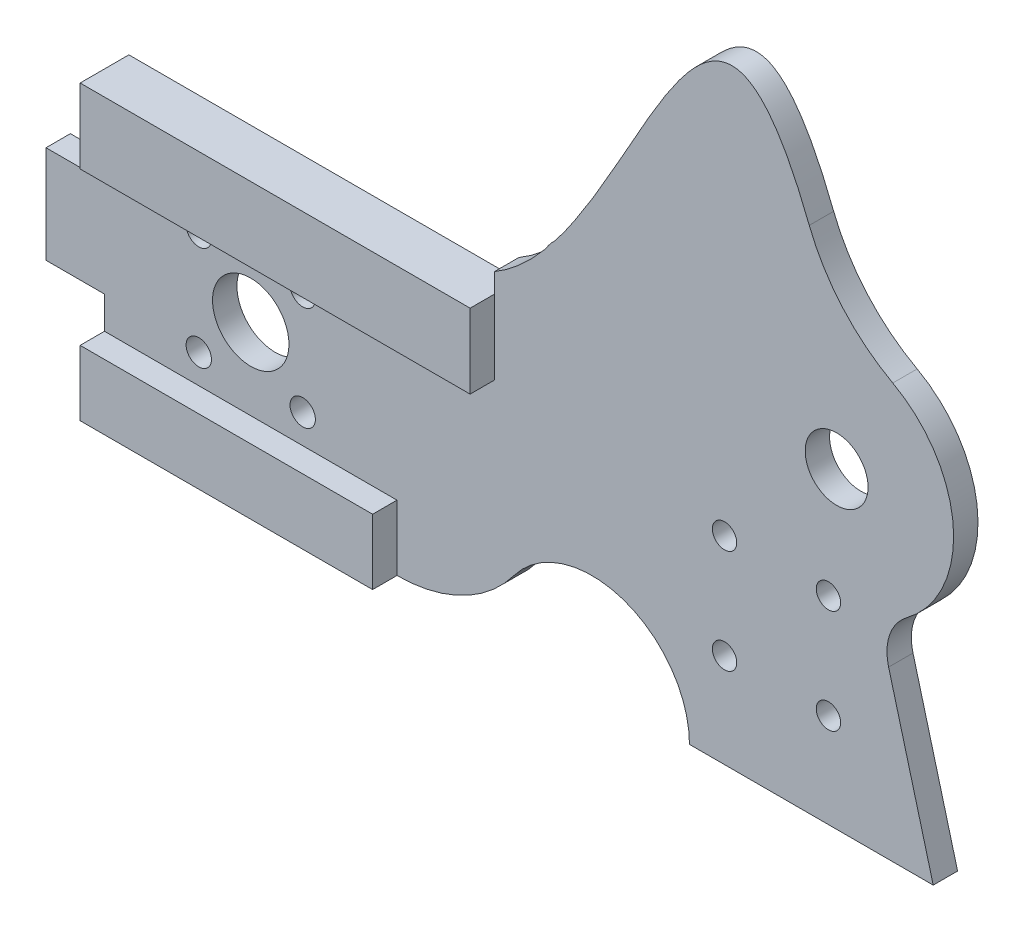
ISO-10303-21;
HEADER;
FILE_DESCRIPTION(('STEP AP214'),'2;1');
FILE_NAME('part.step','',(''),(''),'','','');
FILE_SCHEMA(('AUTOMOTIVE_DESIGN { 1 0 10303 214 1 1 1 1 }'));
ENDSEC;
DATA;
#1=APPLICATION_CONTEXT('core data for automotive mechanical design processes');
#2=APPLICATION_PROTOCOL_DEFINITION('international standard','automotive_design',2000,#1);
#3=PRODUCT_CONTEXT('',#1,'mechanical');
#4=PRODUCT('Part','Part','',(#3));
#5=PRODUCT_RELATED_PRODUCT_CATEGORY('part','',(#4));
#6=PRODUCT_DEFINITION_FORMATION('','',#4);
#7=PRODUCT_DEFINITION_CONTEXT('part definition',#1,'design');
#8=PRODUCT_DEFINITION('design','',#6,#7);
#9=PRODUCT_DEFINITION_SHAPE('','',#8);
#10=(LENGTH_UNIT() NAMED_UNIT(*) SI_UNIT(.MILLI.,.METRE.));
#11=(NAMED_UNIT(*) PLANE_ANGLE_UNIT() SI_UNIT($,.RADIAN.));
#12=(NAMED_UNIT(*) SI_UNIT($,.STERADIAN.) SOLID_ANGLE_UNIT());
#13=UNCERTAINTY_MEASURE_WITH_UNIT(LENGTH_MEASURE(1.E-05),#10,'distance_accuracy_value','');
#14=(GEOMETRIC_REPRESENTATION_CONTEXT(3) GLOBAL_UNCERTAINTY_ASSIGNED_CONTEXT((#13)) GLOBAL_UNIT_ASSIGNED_CONTEXT((#10,
#11,#12)) REPRESENTATION_CONTEXT('',''));
#15=CARTESIAN_POINT('',(0.,0.,0.));
#16=DIRECTION('',(0.,0.,1.));
#17=DIRECTION('',(1.,0.,0.));
#18=AXIS2_PLACEMENT_3D('',#15,#16,#17);
#19=CARTESIAN_POINT('',(0.,0.,3.175));
#20=DIRECTION('',(0.,1.,0.));
#21=DIRECTION('',(0.,0.,1.));
#22=AXIS2_PLACEMENT_3D('',#19,#20,#21);
#23=PLANE('',#22);
#24=DIRECTION('',(1.,0.,0.));
#25=VECTOR('',#24,1.);
#26=CARTESIAN_POINT('',(0.,0.,0.));
#27=LINE('',#26,#25);
#28=CARTESIAN_POINT('',(0.,0.,0.));
#29=VERTEX_POINT('',#28);
#30=CARTESIAN_POINT('',(38.1,0.,0.));
#31=VERTEX_POINT('',#30);
#32=EDGE_CURVE('E800',#29,#31,#27,.T.);
#33=ORIENTED_EDGE('',*,*,#32,.T.);
#34=DIRECTION('',(0.,0.,1.));
#35=VECTOR('',#34,1.);
#36=CARTESIAN_POINT('',(38.1,0.,3.175));
#37=LINE('',#36,#35);
#38=CARTESIAN_POINT('',(38.1,0.,3.175));
#39=VERTEX_POINT('',#38);
#40=EDGE_CURVE('E797',#31,#39,#37,.T.);
#41=ORIENTED_EDGE('',*,*,#40,.T.);
#42=DIRECTION('',(0.,0.,-1.));
#43=VECTOR('',#42,1.);
#44=CARTESIAN_POINT('',(38.1,0.,6.35));
#45=LINE('',#44,#43);
#46=CARTESIAN_POINT('',(38.1,0.,6.35));
#47=VERTEX_POINT('',#46);
#48=EDGE_CURVE('E221',#47,#39,#45,.T.);
#49=ORIENTED_EDGE('',*,*,#48,.F.);
#50=DIRECTION('',(-1.,0.,0.));
#51=VECTOR('',#50,1.);
#52=CARTESIAN_POINT('',(0.,0.,6.35));
#53=LINE('',#52,#51);
#54=CARTESIAN_POINT('',(0.,0.,6.35));
#55=VERTEX_POINT('',#54);
#56=EDGE_CURVE('E214',#47,#55,#53,.T.);
#57=ORIENTED_EDGE('',*,*,#56,.T.);
#58=DIRECTION('',(0.,0.,-1.));
#59=VECTOR('',#58,1.);
#60=CARTESIAN_POINT('',(0.,0.,3.175));
#61=LINE('',#60,#59);
#62=EDGE_CURVE('E194',#55,#29,#61,.T.);
#63=ORIENTED_EDGE('',*,*,#62,.T.);
#64=EDGE_LOOP('',(#33,#41,#49,#57,#63));
#65=FACE_BOUND('',#64,.T.);
#66=ADVANCED_FACE('F41',(#65),#23,.F.);
#67=CARTESIAN_POINT('',(95.3674532925549,40.64,3.175));
#68=DIRECTION('',(0.,0.,1.));
#69=DIRECTION('',(1.,0.,0.));
#70=AXIS2_PLACEMENT_3D('',#67,#68,#69);
#71=PLANE('',#70);
#72=DIRECTION('',(0.,1.,0.));
#73=VECTOR('',#72,1.);
#74=CARTESIAN_POINT('',(38.1,40.64,3.175));
#75=LINE('',#74,#73);
#76=CARTESIAN_POINT('',(38.1,8.5046105109672,3.175));
#77=VERTEX_POINT('',#76);
#78=EDGE_CURVE('E217',#39,#77,#75,.T.);
#79=ORIENTED_EDGE('',*,*,#78,.F.);
#80=CARTESIAN_POINT('',(38.1,19.05,3.175));
#81=DIRECTION('',(0.,0.,1.));
#82=DIRECTION('',(1.,0.,0.));
#83=AXIS2_PLACEMENT_3D('',#80,#81,#82);
#84=CIRCLE('',#83,19.05);
#85=CARTESIAN_POINT('',(53.34,7.62,3.175));
#86=VERTEX_POINT('',#85);
#87=EDGE_CURVE('E793',#39,#86,#84,.T.);
#88=ORIENTED_EDGE('',*,*,#87,.T.);
#89=CARTESIAN_POINT('',(63.5,0.,3.175));
#90=DIRECTION('',(0.,0.,1.));
#91=DIRECTION('',(1.,0.,0.));
#92=AXIS2_PLACEMENT_3D('',#89,#90,#91);
#93=CIRCLE('',#92,12.7);
#94=CARTESIAN_POINT('',(76.2,0.,3.175));
#95=VERTEX_POINT('',#94);
#96=EDGE_CURVE('E864',#95,#86,#93,.T.);
#97=ORIENTED_EDGE('',*,*,#96,.F.);
#98=DIRECTION('',(1.,0.,0.));
#99=VECTOR('',#98,1.);
#100=CARTESIAN_POINT('',(0.,0.,3.175));
#101=LINE('',#100,#99);
#102=CARTESIAN_POINT('',(107.95,0.,3.175));
#103=VERTEX_POINT('',#102);
#104=EDGE_CURVE('E927',#95,#103,#101,.T.);
#105=ORIENTED_EDGE('',*,*,#104,.T.);
#106=DIRECTION('',(-0.258819045102525,0.965925826289067,0.));
#107=VECTOR('',#106,1.);
#108=CARTESIAN_POINT('',(107.95,0.,3.175));
#109=LINE('',#108,#107);
#110=CARTESIAN_POINT('',(102.138767467486,21.6878150659382,3.175));
#111=VERTEX_POINT('',#110);
#112=EDGE_CURVE('E930',#103,#111,#109,.T.);
#113=ORIENTED_EDGE('',*,*,#112,.T.);
#114=CARTESIAN_POINT('',(108.272396464422,23.3313160023389,3.175));
#115=DIRECTION('',(0.,0.,1.));
#116=DIRECTION('',(1.,0.,0.));
#117=AXIS2_PLACEMENT_3D('',#114,#115,#116);
#118=CIRCLE('',#117,6.35);
#119=CARTESIAN_POINT('',(104.476824943284,28.4221054134157,3.175));
#120=VERTEX_POINT('',#119);
#121=EDGE_CURVE('E849',#111,#120,#118,.F.);
#122=ORIENTED_EDGE('',*,*,#121,.T.);
#123=CARTESIAN_POINT('',(95.3674532925549,40.64,3.175));
#124=DIRECTION('',(0.,0.,1.));
#125=DIRECTION('',(1.,0.,0.));
#126=AXIS2_PLACEMENT_3D('',#123,#124,#125);
#127=CIRCLE('',#126,15.24);
#128=CARTESIAN_POINT('',(102.682390609243,54.0097154813751,3.175));
#129=VERTEX_POINT('',#128);
#130=EDGE_CURVE('E838',#120,#129,#127,.T.);
#131=ORIENTED_EDGE('',*,*,#130,.T.);
#132=CARTESIAN_POINT('',(114.264374693999,75.1784316602191,3.175));
#133=DIRECTION('',(0.,0.,1.));
#134=DIRECTION('',(1.,0.,0.));
#135=AXIS2_PLACEMENT_3D('',#132,#133,#134);
#136=CIRCLE('',#135,24.13);
#137=CARTESIAN_POINT('',(91.8054412375965,66.3549851680109,3.175));
#138=VERTEX_POINT('',#137);
#139=EDGE_CURVE('E11',#129,#138,#136,.F.);
#140=ORIENTED_EDGE('',*,*,#139,.T.);
#141=CARTESIAN_POINT('',(95.3674532925549,55.88,3.175));
#142=CARTESIAN_POINT('',(78.5942817419555,111.543427794669,3.175));
#143=CARTESIAN_POINT('',(70.7777889320371,52.1788036708754,3.175));
#144=CARTESIAN_POINT('',(50.8,40.64,3.175));
#145=B_SPLINE_CURVE_WITH_KNOTS('',3,(#141,#142,#143,#144),.UNSPECIFIED.,.F.,.F.,(4,4),(0.,1.),.UNSPECIFIED.);
#146=CARTESIAN_POINT('',(58.7253990220843,48.0986795359845,3.175));
#147=VERTEX_POINT('',#146);
#148=EDGE_CURVE('E268',#138,#147,#145,.T.);
#149=ORIENTED_EDGE('',*,*,#148,.T.);
#150=CARTESIAN_POINT('',(62.9766372231488,43.3817447518466,3.175));
#151=DIRECTION('',(0.,0.,1.));
#152=DIRECTION('',(1.,0.,0.));
#153=AXIS2_PLACEMENT_3D('',#150,#151,#152);
#154=CIRCLE('',#153,6.35);
#155=CARTESIAN_POINT('',(57.4616101020437,46.5292796370345,3.175));
#156=VERTEX_POINT('',#155);
#157=EDGE_CURVE('E804',#147,#156,#154,.T.);
#158=ORIENTED_EDGE('',*,*,#157,.T.);
#159=CARTESIAN_POINT('',(50.8000000000001,40.64,3.175));
#160=VERTEX_POINT('',#159);
#161=EDGE_CURVE('E260',#156,#160,#145,.T.);
#162=ORIENTED_EDGE('',*,*,#161,.T.);
#163=DIRECTION('',(0.,1.,0.));
#164=VECTOR('',#163,1.);
#165=CARTESIAN_POINT('',(50.8,38.1,3.175));
#166=LINE('',#165,#164);
#167=CARTESIAN_POINT('',(50.8,38.1,3.175));
#168=VERTEX_POINT('',#167);
#169=EDGE_CURVE('E266',#168,#160,#166,.T.);
#170=ORIENTED_EDGE('',*,*,#169,.F.);
#171=DIRECTION('',(0.,1.,0.));
#172=VECTOR('',#171,1.);
#173=CARTESIAN_POINT('',(50.8,40.64,3.175));
#174=LINE('',#173,#172);
#175=CARTESIAN_POINT('',(50.8,28.4023189796433,3.175));
#176=VERTEX_POINT('',#175);
#177=EDGE_CURVE('E251',#176,#168,#174,.T.);
#178=ORIENTED_EDGE('',*,*,#177,.F.);
#179=DIRECTION('',(1.,0.,0.));
#180=VECTOR('',#179,1.);
#181=CARTESIAN_POINT('',(95.3674532925549,28.4023189796433,3.175));
#182=LINE('',#181,#180);
#183=CARTESIAN_POINT('',(0.,28.4023189796433,3.175));
#184=VERTEX_POINT('',#183);
#185=EDGE_CURVE('E63',#184,#176,#182,.T.);
#186=ORIENTED_EDGE('',*,*,#185,.F.);
#187=DIRECTION('',(0.,-1.,0.));
#188=VECTOR('',#187,1.);
#189=CARTESIAN_POINT('',(0.,38.1,3.175));
#190=LINE('',#189,#188);
#191=CARTESIAN_POINT('',(0.,25.4,3.175));
#192=VERTEX_POINT('',#191);
#193=EDGE_CURVE('E934',#184,#192,#190,.T.);
#194=ORIENTED_EDGE('',*,*,#193,.T.);
#195=DIRECTION('',(-1.,0.,0.));
#196=VECTOR('',#195,1.);
#197=CARTESIAN_POINT('',(0.,25.4,3.175));
#198=LINE('',#197,#196);
#199=CARTESIAN_POINT('',(-7.62,25.4,3.175));
#200=VERTEX_POINT('',#199);
#201=EDGE_CURVE('E936',#192,#200,#198,.T.);
#202=ORIENTED_EDGE('',*,*,#201,.T.);
#203=DIRECTION('',(0.,-1.,0.));
#204=VECTOR('',#203,1.);
#205=CARTESIAN_POINT('',(-7.62,25.4,3.175));
#206=LINE('',#205,#204);
#207=CARTESIAN_POINT('',(-7.62,12.7,3.175));
#208=VERTEX_POINT('',#207);
#209=EDGE_CURVE('E938',#200,#208,#206,.T.);
#210=ORIENTED_EDGE('',*,*,#209,.T.);
#211=DIRECTION('',(1.,0.,0.));
#212=VECTOR('',#211,1.);
#213=CARTESIAN_POINT('',(0.,12.7,3.175));
#214=LINE('',#213,#212);
#215=CARTESIAN_POINT('',(0.,12.7,3.175));
#216=VERTEX_POINT('',#215);
#217=EDGE_CURVE('E940',#208,#216,#214,.T.);
#218=ORIENTED_EDGE('',*,*,#217,.T.);
#219=DIRECTION('',(0.,-1.,0.));
#220=VECTOR('',#219,1.);
#221=CARTESIAN_POINT('',(0.,12.7,3.175));
#222=LINE('',#221,#220);
#223=CARTESIAN_POINT('',(0.,8.50461051096721,3.175));
#224=VERTEX_POINT('',#223);
#225=EDGE_CURVE('E925',#216,#224,#222,.T.);
#226=ORIENTED_EDGE('',*,*,#225,.T.);
#227=DIRECTION('',(-1.,0.,0.));
#228=VECTOR('',#227,1.);
#229=CARTESIAN_POINT('',(95.3674532925549,8.5046105109672,3.175));
#230=LINE('',#229,#228);
#231=EDGE_CURVE('E56',#77,#224,#230,.T.);
#232=ORIENTED_EDGE('',*,*,#231,.F.);
#233=EDGE_LOOP('',(#79,#88,#97,#105,#113,#122,#131,#140,#149,#158,#162,#170,#178,#186,#194,#202,
#210,#218,#226,#232));
#234=FACE_BOUND('',#233,.T.);
#235=CARTESIAN_POINT('',(19.05,19.05,3.175));
#236=DIRECTION('',(0.,0.,1.));
#237=DIRECTION('',(1.,0.,0.));
#238=AXIS2_PLACEMENT_3D('',#235,#236,#237);
#239=CIRCLE('',#238,4.9784);
#240=CARTESIAN_POINT('',(24.0284,19.05,3.175));
#241=VERTEX_POINT('',#240);
#242=EDGE_CURVE('E865',#241,#241,#239,.T.);
#243=ORIENTED_EDGE('',*,*,#242,.F.);
#244=EDGE_LOOP('',(#243));
#245=FACE_BOUND('',#244,.T.);
#246=CARTESIAN_POINT('',(80.7665827481401,12.2829881040447,3.175));
#247=DIRECTION('',(0.,0.,1.));
#248=DIRECTION('',(1.,0.,0.));
#249=AXIS2_PLACEMENT_3D('',#246,#247,#248);
#250=CIRCLE('',#249,1.5875);
#251=CARTESIAN_POINT('',(82.3540827481401,12.2829881040447,3.175));
#252=VERTEX_POINT('',#251);
#253=EDGE_CURVE('E871',#252,#252,#250,.T.);
#254=ORIENTED_EDGE('',*,*,#253,.F.);
#255=EDGE_LOOP('',(#254));
#256=FACE_BOUND('',#255,.T.);
#257=CARTESIAN_POINT('',(94.2997027481401,12.2829881040447,3.175));
#258=DIRECTION('',(0.,0.,1.));
#259=DIRECTION('',(1.,0.,0.));
#260=AXIS2_PLACEMENT_3D('',#257,#258,#259);
#261=CIRCLE('',#260,1.5875);
#262=CARTESIAN_POINT('',(95.8872027481401,12.2829881040447,3.175));
#263=VERTEX_POINT('',#262);
#264=EDGE_CURVE('E877',#263,#263,#261,.T.);
#265=ORIENTED_EDGE('',*,*,#264,.F.);
#266=EDGE_LOOP('',(#265));
#267=FACE_BOUND('',#266,.T.);
#268=CARTESIAN_POINT('',(80.7665827481401,25.8170118959552,3.175));
#269=DIRECTION('',(0.,0.,1.));
#270=DIRECTION('',(1.,0.,0.));
#271=AXIS2_PLACEMENT_3D('',#268,#269,#270);
#272=CIRCLE('',#271,1.5875);
#273=CARTESIAN_POINT('',(82.3540827481401,25.8170118959552,3.175));
#274=VERTEX_POINT('',#273);
#275=EDGE_CURVE('E883',#274,#274,#272,.T.);
#276=ORIENTED_EDGE('',*,*,#275,.F.);
#277=EDGE_LOOP('',(#276));
#278=FACE_BOUND('',#277,.T.);
#279=CARTESIAN_POINT('',(94.2997027481427,25.8170118959552,3.175));
#280=DIRECTION('',(0.,0.,1.));
#281=DIRECTION('',(1.,0.,0.));
#282=AXIS2_PLACEMENT_3D('',#279,#280,#281);
#283=CIRCLE('',#282,1.5875);
#284=CARTESIAN_POINT('',(95.8872027481427,25.8170118959552,3.175));
#285=VERTEX_POINT('',#284);
#286=EDGE_CURVE('E860',#285,#285,#283,.T.);
#287=ORIENTED_EDGE('',*,*,#286,.F.);
#288=EDGE_LOOP('',(#287));
#289=FACE_BOUND('',#288,.T.);
#290=CARTESIAN_POINT('',(12.2829881040447,12.2829881040447,3.175));
#291=DIRECTION('',(0.,0.,1.));
#292=DIRECTION('',(1.,0.,0.));
#293=AXIS2_PLACEMENT_3D('',#290,#291,#292);
#294=CIRCLE('',#293,1.65099999999998);
#295=CARTESIAN_POINT('',(13.9339881040447,12.2829881040447,3.175));
#296=VERTEX_POINT('',#295);
#297=EDGE_CURVE('E902',#296,#296,#294,.T.);
#298=ORIENTED_EDGE('',*,*,#297,.F.);
#299=EDGE_LOOP('',(#298));
#300=FACE_BOUND('',#299,.T.);
#301=CARTESIAN_POINT('',(25.8170118959553,25.8170118959552,3.175));
#302=DIRECTION('',(0.,0.,1.));
#303=DIRECTION('',(1.,0.,0.));
#304=AXIS2_PLACEMENT_3D('',#301,#302,#303);
#305=CIRCLE('',#304,1.65099999999998);
#306=CARTESIAN_POINT('',(27.4680118959552,25.8170118959552,3.175));
#307=VERTEX_POINT('',#306);
#308=EDGE_CURVE('E914',#307,#307,#305,.T.);
#309=ORIENTED_EDGE('',*,*,#308,.F.);
#310=EDGE_LOOP('',(#309));
#311=FACE_BOUND('',#310,.T.);
#312=CARTESIAN_POINT('',(95.3674532925549,40.64,3.175));
#313=DIRECTION('',(0.,0.,1.));
#314=DIRECTION('',(1.,0.,0.));
#315=AXIS2_PLACEMENT_3D('',#312,#313,#314);
#316=CIRCLE('',#315,4.09574999999999);
#317=CARTESIAN_POINT('',(99.4632032925549,40.64,3.175));
#318=VERTEX_POINT('',#317);
#319=EDGE_CURVE('E920',#318,#318,#316,.T.);
#320=ORIENTED_EDGE('',*,*,#319,.F.);
#321=EDGE_LOOP('',(#320));
#322=FACE_BOUND('',#321,.T.);
#323=CARTESIAN_POINT('',(25.8170118959553,12.2829881040447,3.175));
#324=DIRECTION('',(0.,0.,1.));
#325=DIRECTION('',(1.,0.,0.));
#326=AXIS2_PLACEMENT_3D('',#323,#324,#325);
#327=CIRCLE('',#326,1.65099999999998);
#328=CARTESIAN_POINT('',(27.4680118959552,12.2829881040447,3.175));
#329=VERTEX_POINT('',#328);
#330=EDGE_CURVE('E908',#329,#329,#327,.T.);
#331=ORIENTED_EDGE('',*,*,#330,.F.);
#332=EDGE_LOOP('',(#331));
#333=FACE_BOUND('',#332,.T.);
#334=CARTESIAN_POINT('',(12.2829881040448,25.8170118959553,3.175));
#335=DIRECTION('',(0.,0.,1.));
#336=DIRECTION('',(1.,0.,0.));
#337=AXIS2_PLACEMENT_3D('',#334,#335,#336);
#338=CIRCLE('',#337,1.65099999999999);
#339=CARTESIAN_POINT('',(13.9339881040447,25.8170118959553,3.175));
#340=VERTEX_POINT('',#339);
#341=EDGE_CURVE('E896',#340,#340,#338,.T.);
#342=ORIENTED_EDGE('',*,*,#341,.F.);
#343=EDGE_LOOP('',(#342));
#344=FACE_BOUND('',#343,.T.);
#345=ADVANCED_FACE('F340',(#234,#245,#256,#267,#278,#289,#300,#311,#322,#333,#344),#71,.T.);
#346=CARTESIAN_POINT('',(95.3674532925549,40.64,0.));
#347=DIRECTION('',(0.,0.,1.));
#348=DIRECTION('',(1.,0.,0.));
#349=AXIS2_PLACEMENT_3D('',#346,#347,#348);
#350=PLANE('',#349);
#351=CARTESIAN_POINT('',(38.1,19.05,0.));
#352=DIRECTION('',(0.,0.,1.));
#353=DIRECTION('',(1.,0.,0.));
#354=AXIS2_PLACEMENT_3D('',#351,#352,#353);
#355=CIRCLE('',#354,19.05);
#356=CARTESIAN_POINT('',(53.34,7.62,0.));
#357=VERTEX_POINT('',#356);
#358=EDGE_CURVE('E809',#357,#31,#355,.F.);
#359=ORIENTED_EDGE('',*,*,#358,.T.);
#360=ORIENTED_EDGE('',*,*,#32,.F.);
#361=DIRECTION('',(0.,-1.,0.));
#362=VECTOR('',#361,1.);
#363=CARTESIAN_POINT('',(0.,12.7,0.));
#364=LINE('',#363,#362);
#365=CARTESIAN_POINT('',(0.,12.7,0.));
#366=VERTEX_POINT('',#365);
#367=EDGE_CURVE('E201',#366,#29,#364,.T.);
#368=ORIENTED_EDGE('',*,*,#367,.F.);
#369=DIRECTION('',(1.,0.,0.));
#370=VECTOR('',#369,1.);
#371=CARTESIAN_POINT('',(0.,12.7,0.));
#372=LINE('',#371,#370);
#373=CARTESIAN_POINT('',(-7.62,12.7,0.));
#374=VERTEX_POINT('',#373);
#375=EDGE_CURVE('E928',#374,#366,#372,.T.);
#376=ORIENTED_EDGE('',*,*,#375,.F.);
#377=DIRECTION('',(0.,-1.,0.));
#378=VECTOR('',#377,1.);
#379=CARTESIAN_POINT('',(-7.62,25.4,0.));
#380=LINE('',#379,#378);
#381=CARTESIAN_POINT('',(-7.62,25.4,0.));
#382=VERTEX_POINT('',#381);
#383=EDGE_CURVE('E951',#382,#374,#380,.T.);
#384=ORIENTED_EDGE('',*,*,#383,.F.);
#385=DIRECTION('',(-1.,0.,0.));
#386=VECTOR('',#385,1.);
#387=CARTESIAN_POINT('',(0.,25.4,0.));
#388=LINE('',#387,#386);
#389=CARTESIAN_POINT('',(0.,25.4,0.));
#390=VERTEX_POINT('',#389);
#391=EDGE_CURVE('E949',#390,#382,#388,.T.);
#392=ORIENTED_EDGE('',*,*,#391,.F.);
#393=DIRECTION('',(0.,-1.,0.));
#394=VECTOR('',#393,1.);
#395=CARTESIAN_POINT('',(0.,38.1,0.));
#396=LINE('',#395,#394);
#397=CARTESIAN_POINT('',(0.,38.1,0.));
#398=VERTEX_POINT('',#397);
#399=EDGE_CURVE('E832',#398,#390,#396,.T.);
#400=ORIENTED_EDGE('',*,*,#399,.F.);
#401=DIRECTION('',(1.,0.,0.));
#402=VECTOR('',#401,1.);
#403=CARTESIAN_POINT('',(95.3674532925549,38.1,0.));
#404=LINE('',#403,#402);
#405=CARTESIAN_POINT('',(50.8,38.1,0.));
#406=VERTEX_POINT('',#405);
#407=EDGE_CURVE('E853',#398,#406,#404,.T.);
#408=ORIENTED_EDGE('',*,*,#407,.T.);
#409=DIRECTION('',(0.,1.,0.));
#410=VECTOR('',#409,1.);
#411=CARTESIAN_POINT('',(50.8,40.64,0.));
#412=LINE('',#411,#410);
#413=CARTESIAN_POINT('',(50.8000000000001,40.64,0.));
#414=VERTEX_POINT('',#413);
#415=EDGE_CURVE('E858',#406,#414,#412,.T.);
#416=ORIENTED_EDGE('',*,*,#415,.T.);
#417=CARTESIAN_POINT('',(95.3674532925549,55.88,0.));
#418=CARTESIAN_POINT('',(78.5942817419555,111.543427794669,0.));
#419=CARTESIAN_POINT('',(70.7777889320371,52.1788036708754,0.));
#420=CARTESIAN_POINT('',(50.8,40.64,0.));
#421=B_SPLINE_CURVE_WITH_KNOTS('',3,(#417,#418,#419,#420),.UNSPECIFIED.,.F.,.F.,(4,4),(0.,1.),.UNSPECIFIED.);
#422=CARTESIAN_POINT('',(57.4616101020437,46.5292796370345,0.));
#423=VERTEX_POINT('',#422);
#424=EDGE_CURVE('E267',#423,#414,#421,.T.);
#425=ORIENTED_EDGE('',*,*,#424,.F.);
#426=CARTESIAN_POINT('',(62.9766372231488,43.3817447518466,0.));
#427=DIRECTION('',(0.,0.,1.));
#428=DIRECTION('',(1.,0.,0.));
#429=AXIS2_PLACEMENT_3D('',#426,#427,#428);
#430=CIRCLE('',#429,6.35);
#431=CARTESIAN_POINT('',(58.7253990220894,48.0986795359789,0.));
#432=VERTEX_POINT('',#431);
#433=EDGE_CURVE('E801',#423,#432,#430,.F.);
#434=ORIENTED_EDGE('',*,*,#433,.T.);
#435=CARTESIAN_POINT('',(91.8054412375965,66.3549851680109,0.));
#436=VERTEX_POINT('',#435);
#437=EDGE_CURVE('E261',#436,#432,#421,.T.);
#438=ORIENTED_EDGE('',*,*,#437,.F.);
#439=CARTESIAN_POINT('',(114.264374693999,75.1784316602191,0.));
#440=DIRECTION('',(0.,0.,1.));
#441=DIRECTION('',(1.,0.,0.));
#442=AXIS2_PLACEMENT_3D('',#439,#440,#441);
#443=CIRCLE('',#442,24.13);
#444=CARTESIAN_POINT('',(102.682390609243,54.0097154813751,0.));
#445=VERTEX_POINT('',#444);
#446=EDGE_CURVE('E49',#436,#445,#443,.T.);
#447=ORIENTED_EDGE('',*,*,#446,.T.);
#448=CARTESIAN_POINT('',(95.3674532925549,40.64,0.));
#449=DIRECTION('',(0.,0.,1.));
#450=DIRECTION('',(1.,0.,0.));
#451=AXIS2_PLACEMENT_3D('',#448,#449,#450);
#452=CIRCLE('',#451,15.24);
#453=CARTESIAN_POINT('',(104.476824943284,28.4221054134157,0.));
#454=VERTEX_POINT('',#453);
#455=EDGE_CURVE('E824',#454,#445,#452,.T.);
#456=ORIENTED_EDGE('',*,*,#455,.F.);
#457=CARTESIAN_POINT('',(108.272396464422,23.3313160023389,0.));
#458=DIRECTION('',(0.,0.,1.));
#459=DIRECTION('',(1.,0.,0.));
#460=AXIS2_PLACEMENT_3D('',#457,#458,#459);
#461=CIRCLE('',#460,6.35);
#462=CARTESIAN_POINT('',(102.138767467486,21.6878150659382,0.));
#463=VERTEX_POINT('',#462);
#464=EDGE_CURVE('E974',#454,#463,#461,.T.);
#465=ORIENTED_EDGE('',*,*,#464,.T.);
#466=DIRECTION('',(-0.258819045102477,0.96592582628908,0.));
#467=VECTOR('',#466,1.);
#468=CARTESIAN_POINT('',(100.936260599847,26.1756317924197,0.));
#469=LINE('',#468,#467);
#470=CARTESIAN_POINT('',(107.95,0.,0.));
#471=VERTEX_POINT('',#470);
#472=EDGE_CURVE('E833',#471,#463,#469,.T.);
#473=ORIENTED_EDGE('',*,*,#472,.F.);
#474=CARTESIAN_POINT('',(76.2,0.,0.));
#475=VERTEX_POINT('',#474);
#476=EDGE_CURVE('E944',#475,#471,#27,.T.);
#477=ORIENTED_EDGE('',*,*,#476,.F.);
#478=CARTESIAN_POINT('',(63.5,0.,0.));
#479=DIRECTION('',(0.,0.,1.));
#480=DIRECTION('',(1.,0.,0.));
#481=AXIS2_PLACEMENT_3D('',#478,#479,#480);
#482=CIRCLE('',#481,12.7);
#483=EDGE_CURVE('E892',#475,#357,#482,.T.);
#484=ORIENTED_EDGE('',*,*,#483,.T.);
#485=EDGE_LOOP('',(#359,#360,#368,#376,#384,#392,#400,#408,#416,#425,#434,#438,#447,#456,#465,
#473,#477,#484));
#486=FACE_BOUND('',#485,.T.);
#487=CARTESIAN_POINT('',(19.05,19.05,0.));
#488=DIRECTION('',(0.,0.,1.));
#489=DIRECTION('',(1.,0.,0.));
#490=AXIS2_PLACEMENT_3D('',#487,#488,#489);
#491=CIRCLE('',#490,4.9784);
#492=CARTESIAN_POINT('',(24.0284,19.05,0.));
#493=VERTEX_POINT('',#492);
#494=EDGE_CURVE('E861',#493,#493,#491,.T.);
#495=ORIENTED_EDGE('',*,*,#494,.T.);
#496=EDGE_LOOP('',(#495));
#497=FACE_BOUND('',#496,.T.);
#498=CARTESIAN_POINT('',(80.7665827481401,12.2829881040447,0.));
#499=DIRECTION('',(0.,0.,1.));
#500=DIRECTION('',(1.,0.,0.));
#501=AXIS2_PLACEMENT_3D('',#498,#499,#500);
#502=CIRCLE('',#501,1.5875);
#503=CARTESIAN_POINT('',(82.3540827481401,12.2829881040447,0.));
#504=VERTEX_POINT('',#503);
#505=EDGE_CURVE('E868',#504,#504,#502,.T.);
#506=ORIENTED_EDGE('',*,*,#505,.T.);
#507=EDGE_LOOP('',(#506));
#508=FACE_BOUND('',#507,.T.);
#509=CARTESIAN_POINT('',(94.2997027481401,12.2829881040447,0.));
#510=DIRECTION('',(0.,0.,1.));
#511=DIRECTION('',(1.,0.,0.));
#512=AXIS2_PLACEMENT_3D('',#509,#510,#511);
#513=CIRCLE('',#512,1.5875);
#514=CARTESIAN_POINT('',(95.8872027481401,12.2829881040447,0.));
#515=VERTEX_POINT('',#514);
#516=EDGE_CURVE('E874',#515,#515,#513,.T.);
#517=ORIENTED_EDGE('',*,*,#516,.T.);
#518=EDGE_LOOP('',(#517));
#519=FACE_BOUND('',#518,.T.);
#520=CARTESIAN_POINT('',(80.7665827481401,25.8170118959552,0.));
#521=DIRECTION('',(0.,0.,1.));
#522=DIRECTION('',(1.,0.,0.));
#523=AXIS2_PLACEMENT_3D('',#520,#521,#522);
#524=CIRCLE('',#523,1.5875);
#525=CARTESIAN_POINT('',(82.3540827481401,25.8170118959552,0.));
#526=VERTEX_POINT('',#525);
#527=EDGE_CURVE('E880',#526,#526,#524,.T.);
#528=ORIENTED_EDGE('',*,*,#527,.T.);
#529=EDGE_LOOP('',(#528));
#530=FACE_BOUND('',#529,.T.);
#531=CARTESIAN_POINT('',(94.2997027481427,25.8170118959552,0.));
#532=DIRECTION('',(0.,0.,1.));
#533=DIRECTION('',(1.,0.,0.));
#534=AXIS2_PLACEMENT_3D('',#531,#532,#533);
#535=CIRCLE('',#534,1.5875);
#536=CARTESIAN_POINT('',(95.8872027481427,25.8170118959552,0.));
#537=VERTEX_POINT('',#536);
#538=EDGE_CURVE('E886',#537,#537,#535,.T.);
#539=ORIENTED_EDGE('',*,*,#538,.T.);
#540=EDGE_LOOP('',(#539));
#541=FACE_BOUND('',#540,.T.);
#542=CARTESIAN_POINT('',(95.3674532925549,40.64,0.));
#543=DIRECTION('',(0.,0.,1.));
#544=DIRECTION('',(1.,0.,0.));
#545=AXIS2_PLACEMENT_3D('',#542,#543,#544);
#546=CIRCLE('',#545,4.09574999999999);
#547=CARTESIAN_POINT('',(99.4632032925549,40.64,0.));
#548=VERTEX_POINT('',#547);
#549=EDGE_CURVE('E917',#548,#548,#546,.T.);
#550=ORIENTED_EDGE('',*,*,#549,.T.);
#551=EDGE_LOOP('',(#550));
#552=FACE_BOUND('',#551,.T.);
#553=CARTESIAN_POINT('',(25.8170118959553,25.8170118959552,0.));
#554=DIRECTION('',(0.,0.,1.));
#555=DIRECTION('',(1.,0.,0.));
#556=AXIS2_PLACEMENT_3D('',#553,#554,#555);
#557=CIRCLE('',#556,1.65099999999998);
#558=CARTESIAN_POINT('',(27.4680118959552,25.8170118959552,0.));
#559=VERTEX_POINT('',#558);
#560=EDGE_CURVE('E911',#559,#559,#557,.T.);
#561=ORIENTED_EDGE('',*,*,#560,.T.);
#562=EDGE_LOOP('',(#561));
#563=FACE_BOUND('',#562,.T.);
#564=CARTESIAN_POINT('',(25.8170118959553,12.2829881040447,0.));
#565=DIRECTION('',(0.,0.,1.));
#566=DIRECTION('',(1.,0.,0.));
#567=AXIS2_PLACEMENT_3D('',#564,#565,#566);
#568=CIRCLE('',#567,1.65099999999998);
#569=CARTESIAN_POINT('',(27.4680118959552,12.2829881040447,0.));
#570=VERTEX_POINT('',#569);
#571=EDGE_CURVE('E905',#570,#570,#568,.T.);
#572=ORIENTED_EDGE('',*,*,#571,.T.);
#573=EDGE_LOOP('',(#572));
#574=FACE_BOUND('',#573,.T.);
#575=CARTESIAN_POINT('',(12.2829881040447,12.2829881040447,0.));
#576=DIRECTION('',(0.,0.,1.));
#577=DIRECTION('',(1.,0.,0.));
#578=AXIS2_PLACEMENT_3D('',#575,#576,#577);
#579=CIRCLE('',#578,1.65099999999998);
#580=CARTESIAN_POINT('',(13.9339881040447,12.2829881040447,0.));
#581=VERTEX_POINT('',#580);
#582=EDGE_CURVE('E899',#581,#581,#579,.T.);
#583=ORIENTED_EDGE('',*,*,#582,.T.);
#584=EDGE_LOOP('',(#583));
#585=FACE_BOUND('',#584,.T.);
#586=CARTESIAN_POINT('',(12.2829881040448,25.8170118959553,0.));
#587=DIRECTION('',(0.,0.,1.));
#588=DIRECTION('',(1.,0.,0.));
#589=AXIS2_PLACEMENT_3D('',#586,#587,#588);
#590=CIRCLE('',#589,1.65099999999999);
#591=CARTESIAN_POINT('',(13.9339881040447,25.8170118959553,0.));
#592=VERTEX_POINT('',#591);
#593=EDGE_CURVE('E895',#592,#592,#590,.T.);
#594=ORIENTED_EDGE('',*,*,#593,.T.);
#595=EDGE_LOOP('',(#594));
#596=FACE_BOUND('',#595,.T.);
#597=ADVANCED_FACE('F343',(#486,#497,#508,#519,#530,#541,#552,#563,#574,#585,#596),#350,.F.);
#598=CARTESIAN_POINT('',(0.,12.7,3.175));
#599=DIRECTION('',(1.,0.,0.));
#600=DIRECTION('',(0.,1.,0.));
#601=AXIS2_PLACEMENT_3D('',#598,#599,#600);
#602=PLANE('',#601);
#603=ORIENTED_EDGE('',*,*,#367,.T.);
#604=ORIENTED_EDGE('',*,*,#62,.F.);
#605=DIRECTION('',(0.,1.,0.));
#606=VECTOR('',#605,1.);
#607=CARTESIAN_POINT('',(0.,8.50461051096721,6.35));
#608=LINE('',#607,#606);
#609=CARTESIAN_POINT('',(0.,8.50461051096721,6.35));
#610=VERTEX_POINT('',#609);
#611=EDGE_CURVE('E198',#55,#610,#608,.T.);
#612=ORIENTED_EDGE('',*,*,#611,.T.);
#613=DIRECTION('',(0.,0.,-1.));
#614=VECTOR('',#613,1.);
#615=CARTESIAN_POINT('',(0.,8.50461051096721,6.35));
#616=LINE('',#615,#614);
#617=EDGE_CURVE('E224',#610,#224,#616,.T.);
#618=ORIENTED_EDGE('',*,*,#617,.T.);
#619=ORIENTED_EDGE('',*,*,#225,.F.);
#620=DIRECTION('',(0.,0.,-1.));
#621=VECTOR('',#620,1.);
#622=CARTESIAN_POINT('',(0.,12.7,3.175));
#623=LINE('',#622,#621);
#624=EDGE_CURVE('E942',#216,#366,#623,.T.);
#625=ORIENTED_EDGE('',*,*,#624,.T.);
#626=EDGE_LOOP('',(#603,#604,#612,#618,#619,#625));
#627=FACE_BOUND('',#626,.T.);
#628=ADVANCED_FACE('F196',(#627),#602,.F.);
#629=ORIENTED_EDGE('',*,*,#104,.F.);
#630=DIRECTION('',(0.,0.,1.));
#631=VECTOR('',#630,1.);
#632=CARTESIAN_POINT('',(76.2,0.,-3.175));
#633=LINE('',#632,#631);
#634=EDGE_CURVE('E206',#95,#475,#633,.F.);
#635=ORIENTED_EDGE('',*,*,#634,.T.);
#636=ORIENTED_EDGE('',*,*,#476,.T.);
#637=DIRECTION('',(0.,0.,-1.));
#638=VECTOR('',#637,1.);
#639=CARTESIAN_POINT('',(107.95,0.,3.175));
#640=LINE('',#639,#638);
#641=EDGE_CURVE('E207',#103,#471,#640,.T.);
#642=ORIENTED_EDGE('',*,*,#641,.F.);
#643=EDGE_LOOP('',(#629,#635,#636,#642));
#644=FACE_BOUND('',#643,.T.);
#645=ADVANCED_FACE('F369',(#644),#23,.F.);
#646=CARTESIAN_POINT('',(100.936260599847,26.1756317924197,3.175));
#647=DIRECTION('',(-0.96592582628908,-0.258819045102477,0.));
#648=DIRECTION('',(0.258819045102477,-0.96592582628908,0.));
#649=AXIS2_PLACEMENT_3D('',#646,#647,#648);
#650=PLANE('',#649);
#651=ORIENTED_EDGE('',*,*,#472,.T.);
#652=DIRECTION('',(0.,0.,1.));
#653=VECTOR('',#652,1.);
#654=CARTESIAN_POINT('',(102.138767467486,21.6878150659382,3.175));
#655=LINE('',#654,#653);
#656=EDGE_CURVE('E972',#463,#111,#655,.T.);
#657=ORIENTED_EDGE('',*,*,#656,.T.);
#658=ORIENTED_EDGE('',*,*,#112,.F.);
#659=ORIENTED_EDGE('',*,*,#641,.T.);
#660=EDGE_LOOP('',(#651,#657,#658,#659));
#661=FACE_BOUND('',#660,.T.);
#662=ADVANCED_FACE('F365',(#661),#650,.F.);
#663=CARTESIAN_POINT('',(95.3674532925549,40.64,3.175));
#664=DIRECTION('',(0.,0.,-1.));
#665=DIRECTION('',(-1.,0.,0.));
#666=AXIS2_PLACEMENT_3D('',#663,#664,#665);
#667=CYLINDRICAL_SURFACE('',#666,15.24);
#668=ORIENTED_EDGE('',*,*,#455,.T.);
#669=DIRECTION('',(0.,0.,-1.));
#670=VECTOR('',#669,1.);
#671=CARTESIAN_POINT('',(102.682390609243,54.0097154813751,3.175));
#672=LINE('',#671,#670);
#673=EDGE_CURVE('E819',#445,#129,#672,.F.);
#674=ORIENTED_EDGE('',*,*,#673,.T.);
#675=ORIENTED_EDGE('',*,*,#130,.F.);
#676=DIRECTION('',(0.,0.,-1.));
#677=VECTOR('',#676,1.);
#678=CARTESIAN_POINT('',(104.476824943284,28.4221054134157,3.175));
#679=LINE('',#678,#677);
#680=EDGE_CURVE('E831',#120,#454,#679,.T.);
#681=ORIENTED_EDGE('',*,*,#680,.T.);
#682=EDGE_LOOP('',(#668,#674,#675,#681));
#683=FACE_BOUND('',#682,.T.);
#684=ADVANCED_FACE('F361',(#683),#667,.T.);
#685=CARTESIAN_POINT('',(0.,38.1,3.175));
#686=DIRECTION('',(1.,0.,0.));
#687=DIRECTION('',(0.,1.,0.));
#688=AXIS2_PLACEMENT_3D('',#685,#686,#687);
#689=PLANE('',#688);
#690=ORIENTED_EDGE('',*,*,#193,.F.);
#691=DIRECTION('',(0.,0.,-1.));
#692=VECTOR('',#691,1.);
#693=CARTESIAN_POINT('',(0.,28.4023189796433,6.35));
#694=LINE('',#693,#692);
#695=CARTESIAN_POINT('',(0.,28.4023189796433,6.35));
#696=VERTEX_POINT('',#695);
#697=EDGE_CURVE('E252',#696,#184,#694,.T.);
#698=ORIENTED_EDGE('',*,*,#697,.F.);
#699=DIRECTION('',(0.,1.,0.));
#700=VECTOR('',#699,1.);
#701=CARTESIAN_POINT('',(0.,38.1,6.35));
#702=LINE('',#701,#700);
#703=CARTESIAN_POINT('',(0.,38.1,6.35));
#704=VERTEX_POINT('',#703);
#705=EDGE_CURVE('E241',#696,#704,#702,.T.);
#706=ORIENTED_EDGE('',*,*,#705,.T.);
#707=DIRECTION('',(0.,0.,-1.));
#708=VECTOR('',#707,1.);
#709=CARTESIAN_POINT('',(0.,38.1,3.175));
#710=LINE('',#709,#708);
#711=EDGE_CURVE('E964',#704,#398,#710,.T.);
#712=ORIENTED_EDGE('',*,*,#711,.T.);
#713=ORIENTED_EDGE('',*,*,#399,.T.);
#714=DIRECTION('',(0.,0.,-1.));
#715=VECTOR('',#714,1.);
#716=CARTESIAN_POINT('',(0.,25.4,3.175));
#717=LINE('',#716,#715);
#718=EDGE_CURVE('E961',#192,#390,#717,.T.);
#719=ORIENTED_EDGE('',*,*,#718,.F.);
#720=EDGE_LOOP('',(#690,#698,#706,#712,#713,#719));
#721=FACE_BOUND('',#720,.T.);
#722=ADVANCED_FACE('F357',(#721),#689,.F.);
#723=CARTESIAN_POINT('',(0.,25.4,3.175));
#724=DIRECTION('',(0.,-1.,0.));
#725=DIRECTION('',(0.,0.,-1.));
#726=AXIS2_PLACEMENT_3D('',#723,#724,#725);
#727=PLANE('',#726);
#728=ORIENTED_EDGE('',*,*,#391,.T.);
#729=DIRECTION('',(0.,0.,-1.));
#730=VECTOR('',#729,1.);
#731=CARTESIAN_POINT('',(-7.62,25.4,3.175));
#732=LINE('',#731,#730);
#733=EDGE_CURVE('E958',#200,#382,#732,.T.);
#734=ORIENTED_EDGE('',*,*,#733,.F.);
#735=ORIENTED_EDGE('',*,*,#201,.F.);
#736=ORIENTED_EDGE('',*,*,#718,.T.);
#737=EDGE_LOOP('',(#728,#734,#735,#736));
#738=FACE_BOUND('',#737,.T.);
#739=ADVANCED_FACE('F353',(#738),#727,.F.);
#740=CARTESIAN_POINT('',(-7.62,25.4,3.175));
#741=DIRECTION('',(1.,0.,0.));
#742=DIRECTION('',(0.,1.,0.));
#743=AXIS2_PLACEMENT_3D('',#740,#741,#742);
#744=PLANE('',#743);
#745=ORIENTED_EDGE('',*,*,#383,.T.);
#746=DIRECTION('',(0.,0.,-1.));
#747=VECTOR('',#746,1.);
#748=CARTESIAN_POINT('',(-7.62,12.7,3.175));
#749=LINE('',#748,#747);
#750=EDGE_CURVE('E955',#208,#374,#749,.T.);
#751=ORIENTED_EDGE('',*,*,#750,.F.);
#752=ORIENTED_EDGE('',*,*,#209,.F.);
#753=ORIENTED_EDGE('',*,*,#733,.T.);
#754=EDGE_LOOP('',(#745,#751,#752,#753));
#755=FACE_BOUND('',#754,.T.);
#756=ADVANCED_FACE('F349',(#755),#744,.F.);
#757=CARTESIAN_POINT('',(0.,12.7,3.175));
#758=DIRECTION('',(0.,1.,0.));
#759=DIRECTION('',(-1.,0.,0.));
#760=AXIS2_PLACEMENT_3D('',#757,#758,#759);
#761=PLANE('',#760);
#762=ORIENTED_EDGE('',*,*,#375,.T.);
#763=ORIENTED_EDGE('',*,*,#624,.F.);
#764=ORIENTED_EDGE('',*,*,#217,.F.);
#765=ORIENTED_EDGE('',*,*,#750,.T.);
#766=EDGE_LOOP('',(#762,#763,#764,#765));
#767=FACE_BOUND('',#766,.T.);
#768=ADVANCED_FACE('F338',(#767),#761,.F.);
#769=CARTESIAN_POINT('',(95.3674532925549,40.64,3.175));
#770=DIRECTION('',(0.,0.,-1.));
#771=DIRECTION('',(-1.,0.,0.));
#772=AXIS2_PLACEMENT_3D('',#769,#770,#771);
#773=CYLINDRICAL_SURFACE('',#772,4.09574999999999);
#774=ORIENTED_EDGE('',*,*,#319,.T.);
#775=EDGE_LOOP('',(#774));
#776=FACE_BOUND('',#775,.T.);
#777=ORIENTED_EDGE('',*,*,#549,.F.);
#778=EDGE_LOOP('',(#777));
#779=FACE_BOUND('',#778,.T.);
#780=ADVANCED_FACE('F334',(#776,#779),#773,.F.);
#781=CARTESIAN_POINT('',(25.8170118959553,25.8170118959552,3.175));
#782=DIRECTION('',(0.,0.,-1.));
#783=DIRECTION('',(-1.,0.,0.));
#784=AXIS2_PLACEMENT_3D('',#781,#782,#783);
#785=CYLINDRICAL_SURFACE('',#784,1.65099999999998);
#786=ORIENTED_EDGE('',*,*,#308,.T.);
#787=EDGE_LOOP('',(#786));
#788=FACE_BOUND('',#787,.T.);
#789=ORIENTED_EDGE('',*,*,#560,.F.);
#790=EDGE_LOOP('',(#789));
#791=FACE_BOUND('',#790,.T.);
#792=ADVANCED_FACE('F330',(#788,#791),#785,.F.);
#793=CARTESIAN_POINT('',(25.8170118959553,12.2829881040447,3.175));
#794=DIRECTION('',(0.,0.,-1.));
#795=DIRECTION('',(-1.,0.,0.));
#796=AXIS2_PLACEMENT_3D('',#793,#794,#795);
#797=CYLINDRICAL_SURFACE('',#796,1.65099999999998);
#798=ORIENTED_EDGE('',*,*,#330,.T.);
#799=EDGE_LOOP('',(#798));
#800=FACE_BOUND('',#799,.T.);
#801=ORIENTED_EDGE('',*,*,#571,.F.);
#802=EDGE_LOOP('',(#801));
#803=FACE_BOUND('',#802,.T.);
#804=ADVANCED_FACE('F326',(#800,#803),#797,.F.);
#805=CARTESIAN_POINT('',(12.2829881040447,12.2829881040447,3.175));
#806=DIRECTION('',(0.,0.,-1.));
#807=DIRECTION('',(-1.,0.,0.));
#808=AXIS2_PLACEMENT_3D('',#805,#806,#807);
#809=CYLINDRICAL_SURFACE('',#808,1.65099999999998);
#810=ORIENTED_EDGE('',*,*,#297,.T.);
#811=EDGE_LOOP('',(#810));
#812=FACE_BOUND('',#811,.T.);
#813=ORIENTED_EDGE('',*,*,#582,.F.);
#814=EDGE_LOOP('',(#813));
#815=FACE_BOUND('',#814,.T.);
#816=ADVANCED_FACE('F322',(#812,#815),#809,.F.);
#817=CARTESIAN_POINT('',(12.2829881040448,25.8170118959553,3.175));
#818=DIRECTION('',(0.,0.,-1.));
#819=DIRECTION('',(-1.,0.,0.));
#820=AXIS2_PLACEMENT_3D('',#817,#818,#819);
#821=CYLINDRICAL_SURFACE('',#820,1.65099999999999);
#822=ORIENTED_EDGE('',*,*,#341,.T.);
#823=EDGE_LOOP('',(#822));
#824=FACE_BOUND('',#823,.T.);
#825=ORIENTED_EDGE('',*,*,#593,.F.);
#826=EDGE_LOOP('',(#825));
#827=FACE_BOUND('',#826,.T.);
#828=ADVANCED_FACE('F318',(#824,#827),#821,.F.);
#829=CARTESIAN_POINT('',(63.5,0.,-3.175));
#830=DIRECTION('',(0.,0.,1.));
#831=DIRECTION('',(1.,0.,0.));
#832=AXIS2_PLACEMENT_3D('',#829,#830,#831);
#833=CYLINDRICAL_SURFACE('',#832,12.7);
#834=ORIENTED_EDGE('',*,*,#96,.T.);
#835=DIRECTION('',(0.,0.,1.));
#836=VECTOR('',#835,1.);
#837=CARTESIAN_POINT('',(53.34,7.62,-3.175));
#838=LINE('',#837,#836);
#839=EDGE_CURVE('E798',#86,#357,#838,.F.);
#840=ORIENTED_EDGE('',*,*,#839,.T.);
#841=ORIENTED_EDGE('',*,*,#483,.F.);
#842=ORIENTED_EDGE('',*,*,#634,.F.);
#843=EDGE_LOOP('',(#834,#840,#841,#842));
#844=FACE_BOUND('',#843,.T.);
#845=ADVANCED_FACE('F314',(#844),#833,.F.);
#846=CARTESIAN_POINT('',(94.2997027481427,25.8170118959552,0.));
#847=DIRECTION('',(0.,0.,1.));
#848=DIRECTION('',(1.,0.,0.));
#849=AXIS2_PLACEMENT_3D('',#846,#847,#848);
#850=CYLINDRICAL_SURFACE('',#849,1.5875);
#851=ORIENTED_EDGE('',*,*,#538,.F.);
#852=EDGE_LOOP('',(#851));
#853=FACE_BOUND('',#852,.T.);
#854=ORIENTED_EDGE('',*,*,#286,.T.);
#855=EDGE_LOOP('',(#854));
#856=FACE_BOUND('',#855,.T.);
#857=ADVANCED_FACE('F310',(#853,#856),#850,.F.);
#858=CARTESIAN_POINT('',(80.7665827481401,25.8170118959552,0.));
#859=DIRECTION('',(0.,0.,1.));
#860=DIRECTION('',(1.,0.,0.));
#861=AXIS2_PLACEMENT_3D('',#858,#859,#860);
#862=CYLINDRICAL_SURFACE('',#861,1.5875);
#863=ORIENTED_EDGE('',*,*,#527,.F.);
#864=EDGE_LOOP('',(#863));
#865=FACE_BOUND('',#864,.T.);
#866=ORIENTED_EDGE('',*,*,#275,.T.);
#867=EDGE_LOOP('',(#866));
#868=FACE_BOUND('',#867,.T.);
#869=ADVANCED_FACE('F306',(#865,#868),#862,.F.);
#870=CARTESIAN_POINT('',(94.2997027481401,12.2829881040447,0.));
#871=DIRECTION('',(0.,0.,1.));
#872=DIRECTION('',(1.,0.,0.));
#873=AXIS2_PLACEMENT_3D('',#870,#871,#872);
#874=CYLINDRICAL_SURFACE('',#873,1.5875);
#875=ORIENTED_EDGE('',*,*,#516,.F.);
#876=EDGE_LOOP('',(#875));
#877=FACE_BOUND('',#876,.T.);
#878=ORIENTED_EDGE('',*,*,#264,.T.);
#879=EDGE_LOOP('',(#878));
#880=FACE_BOUND('',#879,.T.);
#881=ADVANCED_FACE('F302',(#877,#880),#874,.F.);
#882=CARTESIAN_POINT('',(80.7665827481401,12.2829881040447,0.));
#883=DIRECTION('',(0.,0.,1.));
#884=DIRECTION('',(1.,0.,0.));
#885=AXIS2_PLACEMENT_3D('',#882,#883,#884);
#886=CYLINDRICAL_SURFACE('',#885,1.5875);
#887=ORIENTED_EDGE('',*,*,#505,.F.);
#888=EDGE_LOOP('',(#887));
#889=FACE_BOUND('',#888,.T.);
#890=ORIENTED_EDGE('',*,*,#253,.T.);
#891=EDGE_LOOP('',(#890));
#892=FACE_BOUND('',#891,.T.);
#893=ADVANCED_FACE('F298',(#889,#892),#886,.F.);
#894=CARTESIAN_POINT('',(19.05,19.05,0.));
#895=DIRECTION('',(0.,0.,1.));
#896=DIRECTION('',(1.,0.,0.));
#897=AXIS2_PLACEMENT_3D('',#894,#895,#896);
#898=CYLINDRICAL_SURFACE('',#897,4.9784);
#899=ORIENTED_EDGE('',*,*,#494,.F.);
#900=EDGE_LOOP('',(#899));
#901=FACE_BOUND('',#900,.T.);
#902=ORIENTED_EDGE('',*,*,#242,.T.);
#903=EDGE_LOOP('',(#902));
#904=FACE_BOUND('',#903,.T.);
#905=ADVANCED_FACE('F295',(#901,#904),#898,.F.);
#906=CARTESIAN_POINT('',(108.272396464422,23.3313160023389,3.175));
#907=DIRECTION('',(0.,0.,-1.));
#908=DIRECTION('',(-1.,0.,0.));
#909=AXIS2_PLACEMENT_3D('',#906,#907,#908);
#910=CYLINDRICAL_SURFACE('',#909,6.35);
#911=ORIENTED_EDGE('',*,*,#121,.F.);
#912=ORIENTED_EDGE('',*,*,#656,.F.);
#913=ORIENTED_EDGE('',*,*,#464,.F.);
#914=ORIENTED_EDGE('',*,*,#680,.F.);
#915=EDGE_LOOP('',(#911,#912,#913,#914));
#916=FACE_BOUND('',#915,.T.);
#917=ADVANCED_FACE('F289',(#916),#910,.F.);
#918=CARTESIAN_POINT('',(50.8,38.1,-47.625));
#919=DIRECTION('',(1.,0.,0.));
#920=DIRECTION('',(0.,0.,-1.));
#921=AXIS2_PLACEMENT_3D('',#918,#919,#920);
#922=PLANE('',#921);
#923=ORIENTED_EDGE('',*,*,#169,.T.);
#924=DIRECTION('',(0.,0.,-1.));
#925=VECTOR('',#924,1.);
#926=CARTESIAN_POINT('',(50.8,40.64,-47.625));
#927=LINE('',#926,#925);
#928=EDGE_CURVE('E846',#160,#414,#927,.T.);
#929=ORIENTED_EDGE('',*,*,#928,.T.);
#930=ORIENTED_EDGE('',*,*,#415,.F.);
#931=DIRECTION('',(0.,0.,1.));
#932=VECTOR('',#931,1.);
#933=CARTESIAN_POINT('',(50.8,38.1,-47.625));
#934=LINE('',#933,#932);
#935=EDGE_CURVE('E852',#406,#168,#934,.T.);
#936=ORIENTED_EDGE('',*,*,#935,.T.);
#937=EDGE_LOOP('',(#923,#929,#930,#936));
#938=FACE_BOUND('',#937,.T.);
#939=ADVANCED_FACE('F285',(#938),#922,.F.);
#940=CARTESIAN_POINT('',(0.,38.1,-47.625));
#941=DIRECTION('',(0.,-1.,0.));
#942=DIRECTION('',(0.,0.,-1.));
#943=AXIS2_PLACEMENT_3D('',#940,#941,#942);
#944=PLANE('',#943);
#945=ORIENTED_EDGE('',*,*,#711,.F.);
#946=DIRECTION('',(1.,0.,0.));
#947=VECTOR('',#946,1.);
#948=CARTESIAN_POINT('',(50.8,38.1,6.35));
#949=LINE('',#948,#947);
#950=CARTESIAN_POINT('',(50.8,38.1,6.35));
#951=VERTEX_POINT('',#950);
#952=EDGE_CURVE('E244',#704,#951,#949,.T.);
#953=ORIENTED_EDGE('',*,*,#952,.T.);
#954=DIRECTION('',(0.,0.,-1.));
#955=VECTOR('',#954,1.);
#956=CARTESIAN_POINT('',(50.8,38.1,6.35));
#957=LINE('',#956,#955);
#958=EDGE_CURVE('E248',#951,#168,#957,.T.);
#959=ORIENTED_EDGE('',*,*,#958,.T.);
#960=ORIENTED_EDGE('',*,*,#935,.F.);
#961=ORIENTED_EDGE('',*,*,#407,.F.);
#962=EDGE_LOOP('',(#945,#953,#959,#960,#961));
#963=FACE_BOUND('',#962,.T.);
#964=ADVANCED_FACE('F288',(#963),#944,.F.);
#965=CARTESIAN_POINT('',(62.9766372231488,43.3817447518466,-16.129));
#966=DIRECTION('',(0.,0.,-1.));
#967=DIRECTION('',(-1.,0.,0.));
#968=AXIS2_PLACEMENT_3D('',#965,#966,#967);
#969=CYLINDRICAL_SURFACE('',#968,6.35);
#970=DIRECTION('',(0.,0.,1.));
#971=VECTOR('',#970,1.);
#972=CARTESIAN_POINT('',(58.7253990220894,48.0986795359789,0.));
#973=LINE('',#972,#971);
#974=EDGE_CURVE('E813',#432,#147,#973,.T.);
#975=ORIENTED_EDGE('',*,*,#974,.F.);
#976=ORIENTED_EDGE('',*,*,#433,.F.);
#977=DIRECTION('',(0.,0.,1.));
#978=VECTOR('',#977,1.);
#979=CARTESIAN_POINT('',(57.4616101020437,46.5292796370345,0.));
#980=LINE('',#979,#978);
#981=EDGE_CURVE('E811',#156,#423,#980,.F.);
#982=ORIENTED_EDGE('',*,*,#981,.F.);
#983=ORIENTED_EDGE('',*,*,#157,.F.);
#984=EDGE_LOOP('',(#975,#976,#982,#983));
#985=FACE_BOUND('',#984,.T.);
#986=ADVANCED_FACE('F293',(#985),#969,.T.);
#987=CARTESIAN_POINT('',(38.1,19.05,-3.175));
#988=DIRECTION('',(0.,0.,1.));
#989=DIRECTION('',(1.,0.,0.));
#990=AXIS2_PLACEMENT_3D('',#987,#988,#989);
#991=CYLINDRICAL_SURFACE('',#990,19.05);
#992=ORIENTED_EDGE('',*,*,#358,.F.);
#993=ORIENTED_EDGE('',*,*,#839,.F.);
#994=ORIENTED_EDGE('',*,*,#87,.F.);
#995=ORIENTED_EDGE('',*,*,#40,.F.);
#996=EDGE_LOOP('',(#992,#993,#994,#995));
#997=FACE_BOUND('',#996,.T.);
#998=ADVANCED_FACE('F281',(#997),#991,.T.);
#999=DIRECTION('',(0.,0.,1.));
#1000=VECTOR('',#999,1.);
#1001=SURFACE_OF_LINEAR_EXTRUSION('',#421,#1000);
#1002=ORIENTED_EDGE('',*,*,#161,.F.);
#1003=ORIENTED_EDGE('',*,*,#981,.T.);
#1004=ORIENTED_EDGE('',*,*,#424,.T.);
#1005=ORIENTED_EDGE('',*,*,#928,.F.);
#1006=EDGE_LOOP('',(#1002,#1003,#1004,#1005));
#1007=FACE_BOUND('',#1006,.T.);
#1008=ADVANCED_FACE('F276',(#1007),#1001,.T.);
#1009=ORIENTED_EDGE('',*,*,#148,.F.);
#1010=DIRECTION('',(0.,0.,1.));
#1011=VECTOR('',#1010,1.);
#1012=CARTESIAN_POINT('',(91.8054412375965,66.3549851680108,3.175));
#1013=LINE('',#1012,#1011);
#1014=EDGE_CURVE('E816',#138,#436,#1013,.F.);
#1015=ORIENTED_EDGE('',*,*,#1014,.T.);
#1016=ORIENTED_EDGE('',*,*,#437,.T.);
#1017=ORIENTED_EDGE('',*,*,#974,.T.);
#1018=EDGE_LOOP('',(#1009,#1015,#1016,#1017));
#1019=FACE_BOUND('',#1018,.T.);
#1020=ADVANCED_FACE('F280',(#1019),#1001,.T.);
#1021=CARTESIAN_POINT('',(114.264374693999,75.1784316602191,1.5875));
#1022=DIRECTION('',(0.,0.,1.));
#1023=DIRECTION('',(1.,0.,0.));
#1024=AXIS2_PLACEMENT_3D('',#1021,#1022,#1023);
#1025=CYLINDRICAL_SURFACE('',#1024,24.13);
#1026=ORIENTED_EDGE('',*,*,#139,.F.);
#1027=ORIENTED_EDGE('',*,*,#673,.F.);
#1028=ORIENTED_EDGE('',*,*,#446,.F.);
#1029=ORIENTED_EDGE('',*,*,#1014,.F.);
#1030=EDGE_LOOP('',(#1026,#1027,#1028,#1029));
#1031=FACE_BOUND('',#1030,.T.);
#1032=ADVANCED_FACE('F43',(#1031),#1025,.F.);
#1033=CARTESIAN_POINT('',(50.8,38.1,6.35));
#1034=DIRECTION('',(1.,0.,0.));
#1035=DIRECTION('',(0.,0.,-1.));
#1036=AXIS2_PLACEMENT_3D('',#1033,#1034,#1035);
#1037=PLANE('',#1036);
#1038=DIRECTION('',(0.,0.,-1.));
#1039=VECTOR('',#1038,1.);
#1040=CARTESIAN_POINT('',(50.8,28.4023189796433,6.35));
#1041=LINE('',#1040,#1039);
#1042=CARTESIAN_POINT('',(50.8,28.4023189796433,6.35));
#1043=VERTEX_POINT('',#1042);
#1044=EDGE_CURVE('E247',#1043,#176,#1041,.T.);
#1045=ORIENTED_EDGE('',*,*,#1044,.T.);
#1046=ORIENTED_EDGE('',*,*,#177,.T.);
#1047=ORIENTED_EDGE('',*,*,#958,.F.);
#1048=DIRECTION('',(0.,-1.,0.));
#1049=VECTOR('',#1048,1.);
#1050=CARTESIAN_POINT('',(50.8,38.1,6.35));
#1051=LINE('',#1050,#1049);
#1052=EDGE_CURVE('E235',#951,#1043,#1051,.T.);
#1053=ORIENTED_EDGE('',*,*,#1052,.T.);
#1054=EDGE_LOOP('',(#1045,#1046,#1047,#1053));
#1055=FACE_BOUND('',#1054,.T.);
#1056=ADVANCED_FACE('F283',(#1055),#1037,.T.);
#1057=CARTESIAN_POINT('',(50.8,28.4023189796433,6.35));
#1058=DIRECTION('',(0.,-1.,0.));
#1059=DIRECTION('',(0.,0.,-1.));
#1060=AXIS2_PLACEMENT_3D('',#1057,#1058,#1059);
#1061=PLANE('',#1060);
#1062=ORIENTED_EDGE('',*,*,#697,.T.);
#1063=ORIENTED_EDGE('',*,*,#185,.T.);
#1064=ORIENTED_EDGE('',*,*,#1044,.F.);
#1065=DIRECTION('',(-1.,0.,0.));
#1066=VECTOR('',#1065,1.);
#1067=CARTESIAN_POINT('',(50.8,28.4023189796433,6.35));
#1068=LINE('',#1067,#1066);
#1069=EDGE_CURVE('E238',#1043,#696,#1068,.T.);
#1070=ORIENTED_EDGE('',*,*,#1069,.T.);
#1071=EDGE_LOOP('',(#1062,#1063,#1064,#1070));
#1072=FACE_BOUND('',#1071,.T.);
#1073=ADVANCED_FACE('F524',(#1072),#1061,.T.);
#1074=CARTESIAN_POINT('',(0.,0.,6.35));
#1075=DIRECTION('',(0.,0.,-1.));
#1076=DIRECTION('',(-1.,0.,0.));
#1077=AXIS2_PLACEMENT_3D('',#1074,#1075,#1076);
#1078=PLANE('',#1077);
#1079=ORIENTED_EDGE('',*,*,#1052,.F.);
#1080=ORIENTED_EDGE('',*,*,#952,.F.);
#1081=ORIENTED_EDGE('',*,*,#705,.F.);
#1082=ORIENTED_EDGE('',*,*,#1069,.F.);
#1083=EDGE_LOOP('',(#1079,#1080,#1081,#1082));
#1084=FACE_BOUND('',#1083,.T.);
#1085=ADVANCED_FACE('F533',(#1084),#1078,.F.);
#1086=CARTESIAN_POINT('',(38.1,8.50461051096721,6.35));
#1087=DIRECTION('',(1.,0.,0.));
#1088=DIRECTION('',(0.,0.,-1.));
#1089=AXIS2_PLACEMENT_3D('',#1086,#1087,#1088);
#1090=PLANE('',#1089);
#1091=ORIENTED_EDGE('',*,*,#48,.T.);
#1092=ORIENTED_EDGE('',*,*,#78,.T.);
#1093=DIRECTION('',(0.,0.,-1.));
#1094=VECTOR('',#1093,1.);
#1095=CARTESIAN_POINT('',(38.1,8.50461051096721,6.35));
#1096=LINE('',#1095,#1094);
#1097=CARTESIAN_POINT('',(38.1,8.50461051096721,6.35));
#1098=VERTEX_POINT('',#1097);
#1099=EDGE_CURVE('E227',#1098,#77,#1096,.T.);
#1100=ORIENTED_EDGE('',*,*,#1099,.F.);
#1101=DIRECTION('',(0.,-1.,0.));
#1102=VECTOR('',#1101,1.);
#1103=CARTESIAN_POINT('',(38.1,8.50461051096721,6.35));
#1104=LINE('',#1103,#1102);
#1105=EDGE_CURVE('E223',#1098,#47,#1104,.T.);
#1106=ORIENTED_EDGE('',*,*,#1105,.T.);
#1107=EDGE_LOOP('',(#1091,#1092,#1100,#1106));
#1108=FACE_BOUND('',#1107,.T.);
#1109=ADVANCED_FACE('F542',(#1108),#1090,.T.);
#1110=CARTESIAN_POINT('',(0.,8.50461051096721,6.35));
#1111=DIRECTION('',(0.,1.,0.));
#1112=DIRECTION('',(0.,0.,1.));
#1113=AXIS2_PLACEMENT_3D('',#1110,#1111,#1112);
#1114=PLANE('',#1113);
#1115=ORIENTED_EDGE('',*,*,#1099,.T.);
#1116=ORIENTED_EDGE('',*,*,#231,.T.);
#1117=ORIENTED_EDGE('',*,*,#617,.F.);
#1118=DIRECTION('',(1.,0.,0.));
#1119=VECTOR('',#1118,1.);
#1120=CARTESIAN_POINT('',(0.,8.50461051096721,6.35));
#1121=LINE('',#1120,#1119);
#1122=EDGE_CURVE('E216',#610,#1098,#1121,.T.);
#1123=ORIENTED_EDGE('',*,*,#1122,.T.);
#1124=EDGE_LOOP('',(#1115,#1116,#1117,#1123));
#1125=FACE_BOUND('',#1124,.T.);
#1126=ADVANCED_FACE('F552',(#1125),#1114,.T.);
#1127=CARTESIAN_POINT('',(0.,0.,6.35));
#1128=DIRECTION('',(0.,0.,1.));
#1129=DIRECTION('',(1.,0.,0.));
#1130=AXIS2_PLACEMENT_3D('',#1127,#1128,#1129);
#1131=PLANE('',#1130);
#1132=ORIENTED_EDGE('',*,*,#611,.F.);
#1133=ORIENTED_EDGE('',*,*,#56,.F.);
#1134=ORIENTED_EDGE('',*,*,#1105,.F.);
#1135=ORIENTED_EDGE('',*,*,#1122,.F.);
#1136=EDGE_LOOP('',(#1132,#1133,#1134,#1135));
#1137=FACE_BOUND('',#1136,.T.);
#1138=ADVANCED_FACE('F212',(#1137),#1131,.T.);
#1139=CLOSED_SHELL('',(#66,#345,#597,#628,#645,#662,#684,#722,#739,#756,#768,#780,#792,#804,
#816,#828,#845,#857,#869,#881,#893,#905,#917,#939,#964,#986,#998,#1008,#1020,#1032,#1056,#1073,
#1085,#1109,#1126,#1138));
#1140=MANIFOLD_SOLID_BREP('B2',#1139);
#1141=ADVANCED_BREP_SHAPE_REPRESENTATION('',(#18,#1140),#14);
#1142=SHAPE_DEFINITION_REPRESENTATION(#9,#1141);
ENDSEC;
END-ISO-10303-21;
